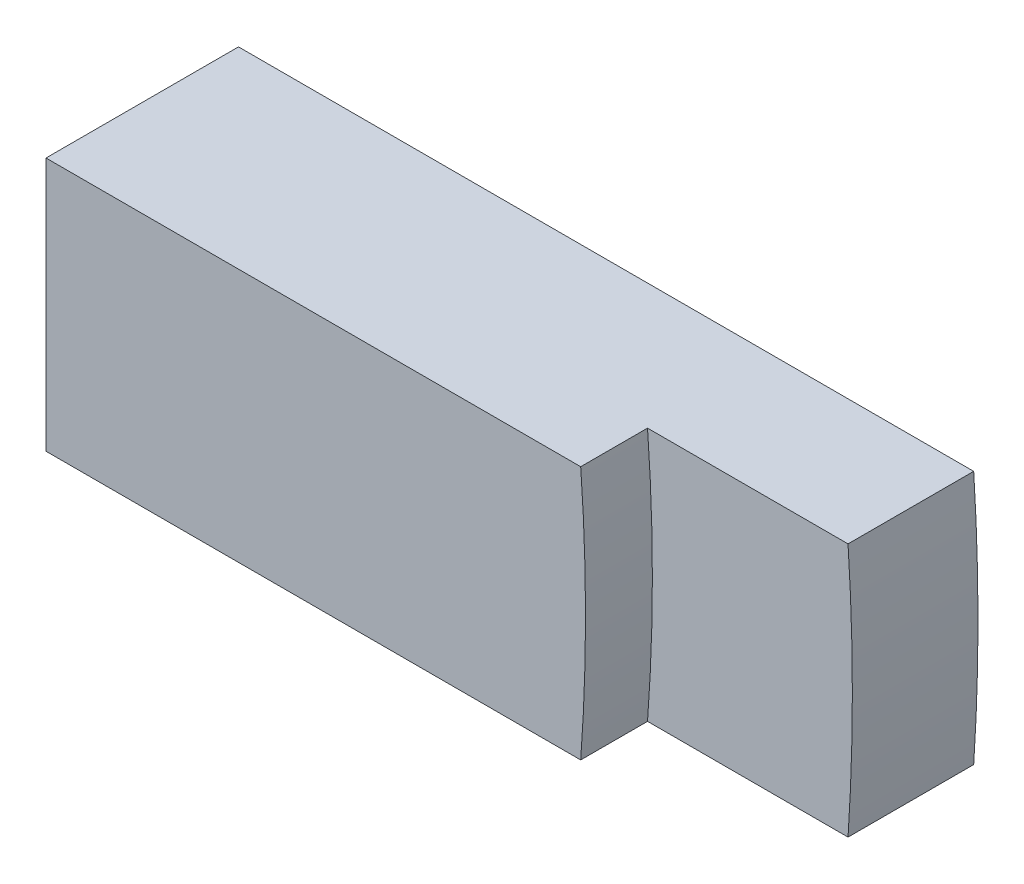
ISO-10303-21;
HEADER;
FILE_DESCRIPTION(('STEP AP214'),'2;1');
FILE_NAME('part.step','',(''),(''),'','','');
FILE_SCHEMA(('AUTOMOTIVE_DESIGN { 1 0 10303 214 1 1 1 1 }'));
ENDSEC;
DATA;
#1=APPLICATION_CONTEXT('core data for automotive mechanical design processes');
#2=APPLICATION_PROTOCOL_DEFINITION('international standard','automotive_design',2000,#1);
#3=PRODUCT_CONTEXT('',#1,'mechanical');
#4=PRODUCT('Part','Part','',(#3));
#5=PRODUCT_RELATED_PRODUCT_CATEGORY('part','',(#4));
#6=PRODUCT_DEFINITION_FORMATION('','',#4);
#7=PRODUCT_DEFINITION_CONTEXT('part definition',#1,'design');
#8=PRODUCT_DEFINITION('design','',#6,#7);
#9=PRODUCT_DEFINITION_SHAPE('','',#8);
#10=(LENGTH_UNIT() NAMED_UNIT(*) SI_UNIT(.MILLI.,.METRE.));
#11=(NAMED_UNIT(*) PLANE_ANGLE_UNIT() SI_UNIT($,.RADIAN.));
#12=(NAMED_UNIT(*) SI_UNIT($,.STERADIAN.) SOLID_ANGLE_UNIT());
#13=UNCERTAINTY_MEASURE_WITH_UNIT(LENGTH_MEASURE(1.E-05),#10,'distance_accuracy_value','');
#14=(GEOMETRIC_REPRESENTATION_CONTEXT(3) GLOBAL_UNCERTAINTY_ASSIGNED_CONTEXT((#13)) GLOBAL_UNIT_ASSIGNED_CONTEXT((#10,
#11,#12)) REPRESENTATION_CONTEXT('',''));
#15=CARTESIAN_POINT('',(0.,0.,0.));
#16=DIRECTION('',(0.,0.,1.));
#17=DIRECTION('',(1.,0.,0.));
#18=AXIS2_PLACEMENT_3D('',#15,#16,#17);
#19=CARTESIAN_POINT('',(-13.2890866050445,0.,1.8288));
#20=DIRECTION('',(0.,0.,-1.));
#21=DIRECTION('',(-1.,0.,0.));
#22=AXIS2_PLACEMENT_3D('',#19,#20,#21);
#23=CYLINDRICAL_SURFACE('',#22,15.875);
#24=CARTESIAN_POINT('',(-13.2890866050445,0.,1.1938));
#25=DIRECTION('',(0.,0.,-1.));
#26=DIRECTION('',(-1.,0.,0.));
#27=AXIS2_PLACEMENT_3D('',#24,#25,#26);
#28=CIRCLE('',#27,15.875);
#29=CARTESIAN_POINT('',(2.54,1.2065,1.1938));
#30=VERTEX_POINT('',#29);
#31=CARTESIAN_POINT('',(2.54,-1.2065,1.1938));
#32=VERTEX_POINT('',#31);
#33=EDGE_CURVE('E11',#30,#32,#28,.T.);
#34=ORIENTED_EDGE('',*,*,#33,.F.);
#35=DIRECTION('',(0.,0.,-1.));
#36=VECTOR('',#35,1.);
#37=CARTESIAN_POINT('',(2.54,1.2065,1.8288));
#38=LINE('',#37,#36);
#39=CARTESIAN_POINT('',(2.54,1.2065,1.8288));
#40=VERTEX_POINT('',#39);
#41=EDGE_CURVE('E42',#40,#30,#38,.T.);
#42=ORIENTED_EDGE('',*,*,#41,.F.);
#43=CARTESIAN_POINT('',(-13.2890866050445,0.,1.8288));
#44=DIRECTION('',(0.,0.,1.));
#45=DIRECTION('',(1.,0.,0.));
#46=AXIS2_PLACEMENT_3D('',#43,#44,#45);
#47=CIRCLE('',#46,15.875);
#48=CARTESIAN_POINT('',(2.54,-1.2065,1.8288));
#49=VERTEX_POINT('',#48);
#50=EDGE_CURVE('E115',#49,#40,#47,.T.);
#51=ORIENTED_EDGE('',*,*,#50,.F.);
#52=DIRECTION('',(0.,0.,-1.));
#53=VECTOR('',#52,1.);
#54=CARTESIAN_POINT('',(2.54,-1.2065,1.8288));
#55=LINE('',#54,#53);
#56=EDGE_CURVE('E52',#49,#32,#55,.T.);
#57=ORIENTED_EDGE('',*,*,#56,.T.);
#58=EDGE_LOOP('',(#34,#42,#51,#57));
#59=FACE_BOUND('',#58,.T.);
#60=ADVANCED_FACE('F35',(#59),#23,.T.);
#61=CARTESIAN_POINT('',(-2.54,1.2065,1.8288));
#62=DIRECTION('',(0.,-1.,0.));
#63=DIRECTION('',(0.,0.,-1.));
#64=AXIS2_PLACEMENT_3D('',#61,#62,#63);
#65=PLANE('',#64);
#66=DIRECTION('',(-1.,0.,0.));
#67=VECTOR('',#66,1.);
#68=CARTESIAN_POINT('',(-2.54,1.2065,0.));
#69=LINE('',#68,#67);
#70=CARTESIAN_POINT('',(4.445,1.2065,0.));
#71=VERTEX_POINT('',#70);
#72=CARTESIAN_POINT('',(-2.54,1.2065,0.));
#73=VERTEX_POINT('',#72);
#74=EDGE_CURVE('E103',#71,#73,#69,.T.);
#75=ORIENTED_EDGE('',*,*,#74,.T.);
#76=DIRECTION('',(0.,0.,-1.));
#77=VECTOR('',#76,1.);
#78=CARTESIAN_POINT('',(-2.54,1.2065,1.8288));
#79=LINE('',#78,#77);
#80=CARTESIAN_POINT('',(-2.54,1.2065,1.8288));
#81=VERTEX_POINT('',#80);
#82=EDGE_CURVE('E131',#81,#73,#79,.T.);
#83=ORIENTED_EDGE('',*,*,#82,.F.);
#84=DIRECTION('',(-1.,0.,0.));
#85=VECTOR('',#84,1.);
#86=CARTESIAN_POINT('',(-2.54,1.2065,1.8288));
#87=LINE('',#86,#85);
#88=EDGE_CURVE('E118',#40,#81,#87,.T.);
#89=ORIENTED_EDGE('',*,*,#88,.F.);
#90=ORIENTED_EDGE('',*,*,#41,.T.);
#91=DIRECTION('',(-1.,0.,0.));
#92=VECTOR('',#91,1.);
#93=CARTESIAN_POINT('',(2.54,1.2065,1.1938));
#94=LINE('',#93,#92);
#95=CARTESIAN_POINT('',(4.445,1.2065,1.1938));
#96=VERTEX_POINT('',#95);
#97=EDGE_CURVE('E109',#96,#30,#94,.T.);
#98=ORIENTED_EDGE('',*,*,#97,.F.);
#99=DIRECTION('',(0.,0.,-1.));
#100=VECTOR('',#99,1.);
#101=CARTESIAN_POINT('',(4.445,1.2065,1.1938));
#102=LINE('',#101,#100);
#103=EDGE_CURVE('E104',#96,#71,#102,.T.);
#104=ORIENTED_EDGE('',*,*,#103,.T.);
#105=EDGE_LOOP('',(#75,#83,#89,#90,#98,#104));
#106=FACE_BOUND('',#105,.T.);
#107=ADVANCED_FACE('F134',(#106),#65,.F.);
#108=CARTESIAN_POINT('',(-2.54,-1.2065,1.8288));
#109=DIRECTION('',(1.,0.,0.));
#110=DIRECTION('',(0.,0.,-1.));
#111=AXIS2_PLACEMENT_3D('',#108,#109,#110);
#112=PLANE('',#111);
#113=DIRECTION('',(0.,-1.,0.));
#114=VECTOR('',#113,1.);
#115=CARTESIAN_POINT('',(-2.54,-1.2065,0.));
#116=LINE('',#115,#114);
#117=CARTESIAN_POINT('',(-2.54,-1.2065,0.));
#118=VERTEX_POINT('',#117);
#119=EDGE_CURVE('E125',#73,#118,#116,.T.);
#120=ORIENTED_EDGE('',*,*,#119,.T.);
#121=DIRECTION('',(0.,0.,-1.));
#122=VECTOR('',#121,1.);
#123=CARTESIAN_POINT('',(-2.54,-1.2065,1.8288));
#124=LINE('',#123,#122);
#125=CARTESIAN_POINT('',(-2.54,-1.2065,1.8288));
#126=VERTEX_POINT('',#125);
#127=EDGE_CURVE('E129',#126,#118,#124,.T.);
#128=ORIENTED_EDGE('',*,*,#127,.F.);
#129=DIRECTION('',(0.,-1.,0.));
#130=VECTOR('',#129,1.);
#131=CARTESIAN_POINT('',(-2.54,-1.2065,1.8288));
#132=LINE('',#131,#130);
#133=EDGE_CURVE('E120',#81,#126,#132,.T.);
#134=ORIENTED_EDGE('',*,*,#133,.F.);
#135=ORIENTED_EDGE('',*,*,#82,.T.);
#136=EDGE_LOOP('',(#120,#128,#134,#135));
#137=FACE_BOUND('',#136,.T.);
#138=ADVANCED_FACE('F145',(#137),#112,.F.);
#139=CARTESIAN_POINT('',(-2.54,-1.2065,1.8288));
#140=DIRECTION('',(0.,1.,0.));
#141=DIRECTION('',(0.,0.,1.));
#142=AXIS2_PLACEMENT_3D('',#139,#140,#141);
#143=PLANE('',#142);
#144=DIRECTION('',(1.,0.,0.));
#145=VECTOR('',#144,1.);
#146=CARTESIAN_POINT('',(-2.54,-1.2065,0.));
#147=LINE('',#146,#145);
#148=CARTESIAN_POINT('',(4.44499999999999,-1.2065,0.));
#149=VERTEX_POINT('',#148);
#150=EDGE_CURVE('E99',#118,#149,#147,.T.);
#151=ORIENTED_EDGE('',*,*,#150,.T.);
#152=DIRECTION('',(0.,0.,-1.));
#153=VECTOR('',#152,1.);
#154=CARTESIAN_POINT('',(4.44499999999999,-1.2065,1.1938));
#155=LINE('',#154,#153);
#156=CARTESIAN_POINT('',(4.44499999999999,-1.2065,1.1938));
#157=VERTEX_POINT('',#156);
#158=EDGE_CURVE('E95',#157,#149,#155,.T.);
#159=ORIENTED_EDGE('',*,*,#158,.F.);
#160=DIRECTION('',(1.,0.,0.));
#161=VECTOR('',#160,1.);
#162=CARTESIAN_POINT('',(2.54,-1.2065,1.1938));
#163=LINE('',#162,#161);
#164=EDGE_CURVE('E84',#32,#157,#163,.T.);
#165=ORIENTED_EDGE('',*,*,#164,.F.);
#166=ORIENTED_EDGE('',*,*,#56,.F.);
#167=DIRECTION('',(1.,0.,0.));
#168=VECTOR('',#167,1.);
#169=CARTESIAN_POINT('',(-2.54,-1.2065,1.8288));
#170=LINE('',#169,#168);
#171=EDGE_CURVE('E122',#126,#49,#170,.T.);
#172=ORIENTED_EDGE('',*,*,#171,.F.);
#173=ORIENTED_EDGE('',*,*,#127,.T.);
#174=EDGE_LOOP('',(#151,#159,#165,#166,#172,#173));
#175=FACE_BOUND('',#174,.T.);
#176=ADVANCED_FACE('F96',(#175),#143,.F.);
#177=CARTESIAN_POINT('',(-13.2890866050445,0.,1.8288));
#178=DIRECTION('',(0.,0.,1.));
#179=DIRECTION('',(1.,0.,0.));
#180=AXIS2_PLACEMENT_3D('',#177,#178,#179);
#181=PLANE('',#180);
#182=ORIENTED_EDGE('',*,*,#50,.T.);
#183=ORIENTED_EDGE('',*,*,#88,.T.);
#184=ORIENTED_EDGE('',*,*,#133,.T.);
#185=ORIENTED_EDGE('',*,*,#171,.T.);
#186=EDGE_LOOP('',(#182,#183,#184,#185));
#187=FACE_BOUND('',#186,.T.);
#188=ADVANCED_FACE('F137',(#187),#181,.T.);
#189=CARTESIAN_POINT('',(-13.2890866050445,0.,0.));
#190=DIRECTION('',(0.,0.,1.));
#191=DIRECTION('',(1.,0.,0.));
#192=AXIS2_PLACEMENT_3D('',#189,#190,#191);
#193=PLANE('',#192);
#194=ORIENTED_EDGE('',*,*,#74,.F.);
#195=CARTESIAN_POINT('',(-13.2940179477332,0.,0.));
#196=DIRECTION('',(0.,0.,1.));
#197=DIRECTION('',(-1.,0.,0.));
#198=AXIS2_PLACEMENT_3D('',#195,#196,#197);
#199=CIRCLE('',#198,17.78);
#200=EDGE_CURVE('E92',#149,#71,#199,.T.);
#201=ORIENTED_EDGE('',*,*,#200,.F.);
#202=ORIENTED_EDGE('',*,*,#150,.F.);
#203=ORIENTED_EDGE('',*,*,#119,.F.);
#204=EDGE_LOOP('',(#194,#201,#202,#203));
#205=FACE_BOUND('',#204,.T.);
#206=ADVANCED_FACE('F144',(#205),#193,.F.);
#207=CARTESIAN_POINT('',(-13.2940179477332,0.,1.1938));
#208=DIRECTION('',(0.,0.,-1.));
#209=DIRECTION('',(-1.,0.,0.));
#210=AXIS2_PLACEMENT_3D('',#207,#208,#209);
#211=CYLINDRICAL_SURFACE('',#210,17.78);
#212=ORIENTED_EDGE('',*,*,#200,.T.);
#213=ORIENTED_EDGE('',*,*,#103,.F.);
#214=CARTESIAN_POINT('',(-13.2940179477332,0.,1.1938));
#215=DIRECTION('',(0.,0.,1.));
#216=DIRECTION('',(-1.,0.,0.));
#217=AXIS2_PLACEMENT_3D('',#214,#215,#216);
#218=CIRCLE('',#217,17.78);
#219=EDGE_CURVE('E89',#157,#96,#218,.T.);
#220=ORIENTED_EDGE('',*,*,#219,.F.);
#221=ORIENTED_EDGE('',*,*,#158,.T.);
#222=EDGE_LOOP('',(#212,#213,#220,#221));
#223=FACE_BOUND('',#222,.T.);
#224=ADVANCED_FACE('F106',(#223),#211,.T.);
#225=CARTESIAN_POINT('',(-13.2940179477332,0.,1.1938));
#226=DIRECTION('',(0.,0.,-1.));
#227=DIRECTION('',(-1.,0.,0.));
#228=AXIS2_PLACEMENT_3D('',#225,#226,#227);
#229=PLANE('',#228);
#230=ORIENTED_EDGE('',*,*,#97,.T.);
#231=ORIENTED_EDGE('',*,*,#33,.T.);
#232=ORIENTED_EDGE('',*,*,#164,.T.);
#233=ORIENTED_EDGE('',*,*,#219,.T.);
#234=EDGE_LOOP('',(#230,#231,#232,#233));
#235=FACE_BOUND('',#234,.T.);
#236=ADVANCED_FACE('F87',(#235),#229,.F.);
#237=CLOSED_SHELL('',(#60,#107,#138,#176,#188,#206,#224,#236));
#238=MANIFOLD_SOLID_BREP('B2',#237);
#239=ADVANCED_BREP_SHAPE_REPRESENTATION('',(#18,#238),#14);
#240=SHAPE_DEFINITION_REPRESENTATION(#9,#239);
ENDSEC;
END-ISO-10303-21;
